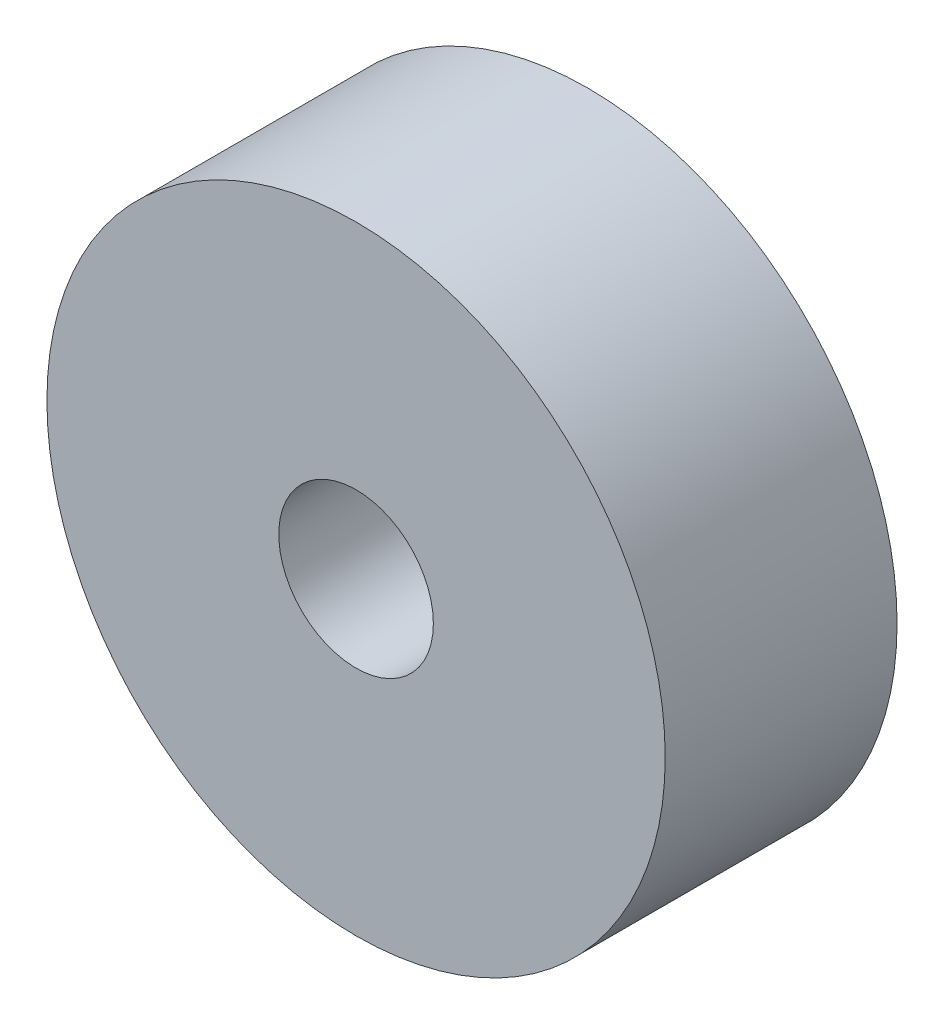
ISO-10303-21;
HEADER;
FILE_DESCRIPTION(('STEP AP214'),'2;1');
FILE_NAME('part.step','',(''),(''),'','','');
FILE_SCHEMA(('AUTOMOTIVE_DESIGN { 1 0 10303 214 1 1 1 1 }'));
ENDSEC;
DATA;
#1=APPLICATION_CONTEXT('core data for automotive mechanical design processes');
#2=APPLICATION_PROTOCOL_DEFINITION('international standard','automotive_design',2000,#1);
#3=PRODUCT_CONTEXT('',#1,'mechanical');
#4=PRODUCT('Part','Part','',(#3));
#5=PRODUCT_RELATED_PRODUCT_CATEGORY('part','',(#4));
#6=PRODUCT_DEFINITION_FORMATION('','',#4);
#7=PRODUCT_DEFINITION_CONTEXT('part definition',#1,'design');
#8=PRODUCT_DEFINITION('design','',#6,#7);
#9=PRODUCT_DEFINITION_SHAPE('','',#8);
#10=(LENGTH_UNIT() NAMED_UNIT(*) SI_UNIT(.MILLI.,.METRE.));
#11=(NAMED_UNIT(*) PLANE_ANGLE_UNIT() SI_UNIT($,.RADIAN.));
#12=(NAMED_UNIT(*) SI_UNIT($,.STERADIAN.) SOLID_ANGLE_UNIT());
#13=UNCERTAINTY_MEASURE_WITH_UNIT(LENGTH_MEASURE(1.E-05),#10,'distance_accuracy_value','');
#14=(GEOMETRIC_REPRESENTATION_CONTEXT(3) GLOBAL_UNCERTAINTY_ASSIGNED_CONTEXT((#13)) GLOBAL_UNIT_ASSIGNED_CONTEXT((#10,
#11,#12)) REPRESENTATION_CONTEXT('',''));
#15=CARTESIAN_POINT('',(0.,0.,0.));
#16=DIRECTION('',(0.,0.,1.));
#17=DIRECTION('',(1.,0.,0.));
#18=AXIS2_PLACEMENT_3D('',#15,#16,#17);
#19=CARTESIAN_POINT('',(0.,0.,3.));
#20=DIRECTION('',(0.,0.,-1.));
#21=DIRECTION('',(-1.,0.,0.));
#22=AXIS2_PLACEMENT_3D('',#19,#20,#21);
#23=CYLINDRICAL_SURFACE('',#22,4.);
#24=CARTESIAN_POINT('',(0.,0.,3.));
#25=DIRECTION('',(0.,0.,1.));
#26=DIRECTION('',(1.,0.,0.));
#27=AXIS2_PLACEMENT_3D('',#24,#25,#26);
#28=CIRCLE('',#27,4.);
#29=CARTESIAN_POINT('',(4.,0.,3.));
#30=VERTEX_POINT('',#29);
#31=EDGE_CURVE('E10',#30,#30,#28,.T.);
#32=ORIENTED_EDGE('',*,*,#31,.F.);
#33=EDGE_LOOP('',(#32));
#34=FACE_BOUND('',#33,.T.);
#35=CARTESIAN_POINT('',(0.,0.,0.));
#36=DIRECTION('',(0.,0.,1.));
#37=DIRECTION('',(1.,0.,0.));
#38=AXIS2_PLACEMENT_3D('',#35,#36,#37);
#39=CIRCLE('',#38,4.);
#40=CARTESIAN_POINT('',(4.,0.,0.));
#41=VERTEX_POINT('',#40);
#42=EDGE_CURVE('E34',#41,#41,#39,.T.);
#43=ORIENTED_EDGE('',*,*,#42,.T.);
#44=EDGE_LOOP('',(#43));
#45=FACE_BOUND('',#44,.T.);
#46=ADVANCED_FACE('F31',(#34,#45),#23,.T.);
#47=CARTESIAN_POINT('',(0.,0.,3.));
#48=DIRECTION('',(0.,0.,1.));
#49=DIRECTION('',(1.,0.,0.));
#50=AXIS2_PLACEMENT_3D('',#47,#48,#49);
#51=PLANE('',#50);
#52=CARTESIAN_POINT('',(0.,0.,3.));
#53=DIRECTION('',(0.,0.,1.));
#54=DIRECTION('',(1.,0.,0.));
#55=AXIS2_PLACEMENT_3D('',#52,#53,#54);
#56=CIRCLE('',#55,1.);
#57=CARTESIAN_POINT('',(1.,0.,3.));
#58=VERTEX_POINT('',#57);
#59=EDGE_CURVE('E43',#58,#58,#56,.T.);
#60=ORIENTED_EDGE('',*,*,#59,.F.);
#61=EDGE_LOOP('',(#60));
#62=FACE_BOUND('',#61,.T.);
#63=ORIENTED_EDGE('',*,*,#31,.T.);
#64=EDGE_LOOP('',(#63));
#65=FACE_BOUND('',#64,.T.);
#66=ADVANCED_FACE('F58',(#62,#65),#51,.T.);
#67=CARTESIAN_POINT('',(0.,0.,0.));
#68=DIRECTION('',(0.,0.,1.));
#69=DIRECTION('',(1.,0.,0.));
#70=AXIS2_PLACEMENT_3D('',#67,#68,#69);
#71=PLANE('',#70);
#72=CARTESIAN_POINT('',(0.,0.,0.));
#73=DIRECTION('',(0.,0.,1.));
#74=DIRECTION('',(1.,0.,0.));
#75=AXIS2_PLACEMENT_3D('',#72,#73,#74);
#76=CIRCLE('',#75,1.);
#77=CARTESIAN_POINT('',(1.,0.,0.));
#78=VERTEX_POINT('',#77);
#79=EDGE_CURVE('E41',#78,#78,#76,.T.);
#80=ORIENTED_EDGE('',*,*,#79,.T.);
#81=EDGE_LOOP('',(#80));
#82=FACE_BOUND('',#81,.T.);
#83=ORIENTED_EDGE('',*,*,#42,.F.);
#84=EDGE_LOOP('',(#83));
#85=FACE_BOUND('',#84,.T.);
#86=ADVANCED_FACE('F49',(#82,#85),#71,.F.);
#87=CARTESIAN_POINT('',(0.,0.,0.));
#88=DIRECTION('',(0.,0.,1.));
#89=DIRECTION('',(1.,0.,0.));
#90=AXIS2_PLACEMENT_3D('',#87,#88,#89);
#91=CYLINDRICAL_SURFACE('',#90,1.);
#92=ORIENTED_EDGE('',*,*,#79,.F.);
#93=EDGE_LOOP('',(#92));
#94=FACE_BOUND('',#93,.T.);
#95=ORIENTED_EDGE('',*,*,#59,.T.);
#96=EDGE_LOOP('',(#95));
#97=FACE_BOUND('',#96,.T.);
#98=ADVANCED_FACE('F52',(#94,#97),#91,.F.);
#99=CLOSED_SHELL('',(#46,#66,#86,#98));
#100=MANIFOLD_SOLID_BREP('B2',#99);
#101=ADVANCED_BREP_SHAPE_REPRESENTATION('',(#18,#100),#14);
#102=SHAPE_DEFINITION_REPRESENTATION(#9,#101);
ENDSEC;
END-ISO-10303-21;
